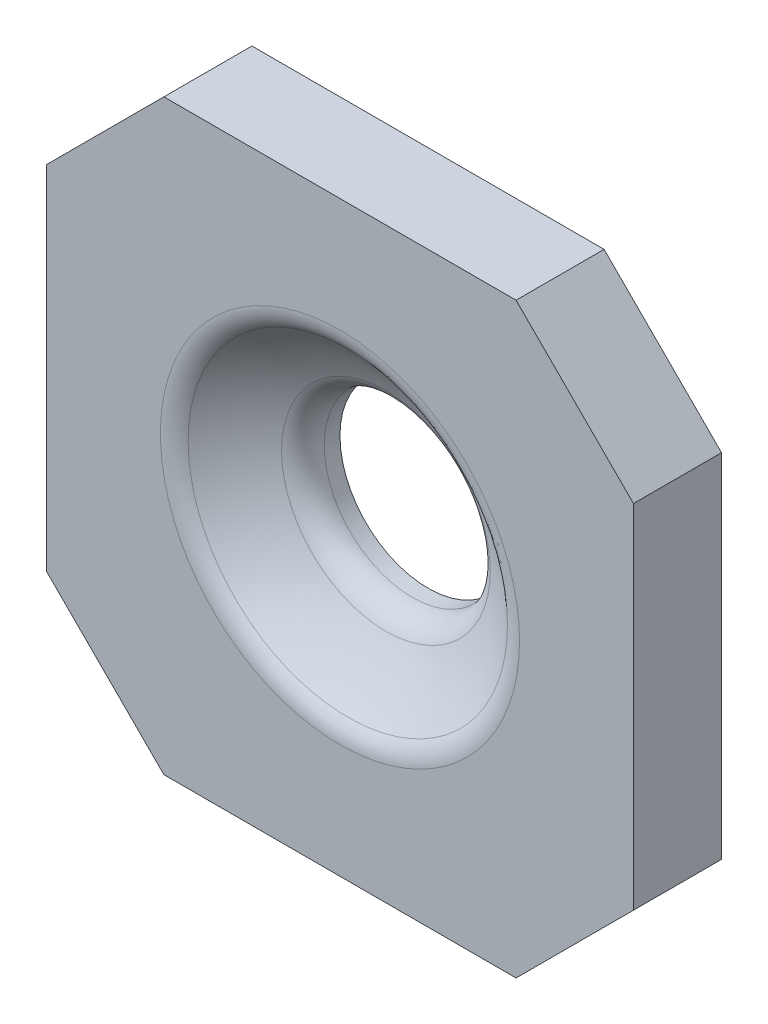
ISO-10303-21;
HEADER;
FILE_DESCRIPTION(('STEP AP214'),'2;1');
FILE_NAME('part.step','',(''),(''),'','','');
FILE_SCHEMA(('AUTOMOTIVE_DESIGN { 1 0 10303 214 1 1 1 1 }'));
ENDSEC;
DATA;
#1=APPLICATION_CONTEXT('core data for automotive mechanical design processes');
#2=APPLICATION_PROTOCOL_DEFINITION('international standard','automotive_design',2000,#1);
#3=PRODUCT_CONTEXT('',#1,'mechanical');
#4=PRODUCT('Part','Part','',(#3));
#5=PRODUCT_RELATED_PRODUCT_CATEGORY('part','',(#4));
#6=PRODUCT_DEFINITION_FORMATION('','',#4);
#7=PRODUCT_DEFINITION_CONTEXT('part definition',#1,'design');
#8=PRODUCT_DEFINITION('design','',#6,#7);
#9=PRODUCT_DEFINITION_SHAPE('','',#8);
#10=(LENGTH_UNIT() NAMED_UNIT(*) SI_UNIT(.MILLI.,.METRE.));
#11=(NAMED_UNIT(*) PLANE_ANGLE_UNIT() SI_UNIT($,.RADIAN.));
#12=(NAMED_UNIT(*) SI_UNIT($,.STERADIAN.) SOLID_ANGLE_UNIT());
#13=UNCERTAINTY_MEASURE_WITH_UNIT(LENGTH_MEASURE(1.E-05),#10,'distance_accuracy_value','');
#14=(GEOMETRIC_REPRESENTATION_CONTEXT(3) GLOBAL_UNCERTAINTY_ASSIGNED_CONTEXT((#13)) GLOBAL_UNIT_ASSIGNED_CONTEXT((#10,
#11,#12)) REPRESENTATION_CONTEXT('',''));
#15=CARTESIAN_POINT('',(0.,0.,0.));
#16=DIRECTION('',(0.,0.,1.));
#17=DIRECTION('',(1.,0.,0.));
#18=AXIS2_PLACEMENT_3D('',#15,#16,#17);
#19=CARTESIAN_POINT('',(50.,50.,15.));
#20=DIRECTION('',(-1.,0.,0.));
#21=DIRECTION('',(0.,-1.,0.));
#22=AXIS2_PLACEMENT_3D('',#19,#20,#21);
#23=PLANE('',#22);
#24=DIRECTION('',(0.,1.,0.));
#25=VECTOR('',#24,1.);
#26=CARTESIAN_POINT('',(50.,50.,0.));
#27=LINE('',#26,#25);
#28=CARTESIAN_POINT('',(50.,-30.,0.));
#29=VERTEX_POINT('',#28);
#30=CARTESIAN_POINT('',(50.,29.9999999999999,0.));
#31=VERTEX_POINT('',#30);
#32=EDGE_CURVE('E150',#29,#31,#27,.T.);
#33=ORIENTED_EDGE('',*,*,#32,.T.);
#34=DIRECTION('',(0.,0.,1.));
#35=VECTOR('',#34,1.);
#36=CARTESIAN_POINT('',(50.,29.9999999999999,15.));
#37=LINE('',#36,#35);
#38=CARTESIAN_POINT('',(50.,29.9999999999999,15.));
#39=VERTEX_POINT('',#38);
#40=EDGE_CURVE('E184',#31,#39,#37,.T.);
#41=ORIENTED_EDGE('',*,*,#40,.T.);
#42=DIRECTION('',(0.,1.,0.));
#43=VECTOR('',#42,1.);
#44=CARTESIAN_POINT('',(50.,50.,15.));
#45=LINE('',#44,#43);
#46=CARTESIAN_POINT('',(50.,-30.,15.));
#47=VERTEX_POINT('',#46);
#48=EDGE_CURVE('E148',#47,#39,#45,.T.);
#49=ORIENTED_EDGE('',*,*,#48,.F.);
#50=DIRECTION('',(0.,0.,-1.));
#51=VECTOR('',#50,1.);
#52=CARTESIAN_POINT('',(50.,-30.,15.));
#53=LINE('',#52,#51);
#54=EDGE_CURVE('E180',#47,#29,#53,.T.);
#55=ORIENTED_EDGE('',*,*,#54,.T.);
#56=EDGE_LOOP('',(#33,#41,#49,#55));
#57=FACE_BOUND('',#56,.T.);
#58=ADVANCED_FACE('F47',(#57),#23,.F.);
#59=CARTESIAN_POINT('',(-50.,50.,15.));
#60=DIRECTION('',(0.,-1.,0.));
#61=DIRECTION('',(0.,0.,-1.));
#62=AXIS2_PLACEMENT_3D('',#59,#60,#61);
#63=PLANE('',#62);
#64=DIRECTION('',(-1.,0.,0.));
#65=VECTOR('',#64,1.);
#66=CARTESIAN_POINT('',(-50.,50.,0.));
#67=LINE('',#66,#65);
#68=CARTESIAN_POINT('',(30.,50.,0.));
#69=VERTEX_POINT('',#68);
#70=CARTESIAN_POINT('',(-30.,50.,0.));
#71=VERTEX_POINT('',#70);
#72=EDGE_CURVE('E144',#69,#71,#67,.T.);
#73=ORIENTED_EDGE('',*,*,#72,.T.);
#74=DIRECTION('',(0.,0.,1.));
#75=VECTOR('',#74,1.);
#76=CARTESIAN_POINT('',(-30.,50.,15.));
#77=LINE('',#76,#75);
#78=CARTESIAN_POINT('',(-30.,50.,15.));
#79=VERTEX_POINT('',#78);
#80=EDGE_CURVE('E120',#71,#79,#77,.T.);
#81=ORIENTED_EDGE('',*,*,#80,.T.);
#82=DIRECTION('',(-1.,0.,0.));
#83=VECTOR('',#82,1.);
#84=CARTESIAN_POINT('',(-50.,50.,15.));
#85=LINE('',#84,#83);
#86=CARTESIAN_POINT('',(30.,50.,15.));
#87=VERTEX_POINT('',#86);
#88=EDGE_CURVE('E267',#87,#79,#85,.T.);
#89=ORIENTED_EDGE('',*,*,#88,.F.);
#90=DIRECTION('',(0.,0.,-1.));
#91=VECTOR('',#90,1.);
#92=CARTESIAN_POINT('',(30.,50.,15.));
#93=LINE('',#92,#91);
#94=EDGE_CURVE('E126',#87,#69,#93,.T.);
#95=ORIENTED_EDGE('',*,*,#94,.T.);
#96=EDGE_LOOP('',(#73,#81,#89,#95));
#97=FACE_BOUND('',#96,.T.);
#98=ADVANCED_FACE('F218',(#97),#63,.F.);
#99=CARTESIAN_POINT('',(-50.,50.,15.));
#100=DIRECTION('',(1.,0.,0.));
#101=DIRECTION('',(0.,1.,0.));
#102=AXIS2_PLACEMENT_3D('',#99,#100,#101);
#103=PLANE('',#102);
#104=DIRECTION('',(0.,-1.,0.));
#105=VECTOR('',#104,1.);
#106=CARTESIAN_POINT('',(-50.,50.,15.));
#107=LINE('',#106,#105);
#108=CARTESIAN_POINT('',(-50.,30.,15.));
#109=VERTEX_POINT('',#108);
#110=CARTESIAN_POINT('',(-50.,-29.9999999999999,15.));
#111=VERTEX_POINT('',#110);
#112=EDGE_CURVE('E135',#109,#111,#107,.T.);
#113=ORIENTED_EDGE('',*,*,#112,.F.);
#114=DIRECTION('',(0.,0.,-1.));
#115=VECTOR('',#114,1.);
#116=CARTESIAN_POINT('',(-50.,30.,15.));
#117=LINE('',#116,#115);
#118=CARTESIAN_POINT('',(-50.,30.,0.));
#119=VERTEX_POINT('',#118);
#120=EDGE_CURVE('E119',#109,#119,#117,.T.);
#121=ORIENTED_EDGE('',*,*,#120,.T.);
#122=DIRECTION('',(0.,-1.,0.));
#123=VECTOR('',#122,1.);
#124=CARTESIAN_POINT('',(-50.,50.,0.));
#125=LINE('',#124,#123);
#126=CARTESIAN_POINT('',(-50.,-29.9999999999999,0.));
#127=VERTEX_POINT('',#126);
#128=EDGE_CURVE('E133',#119,#127,#125,.T.);
#129=ORIENTED_EDGE('',*,*,#128,.T.);
#130=DIRECTION('',(0.,0.,1.));
#131=VECTOR('',#130,1.);
#132=CARTESIAN_POINT('',(-50.,-29.9999999999999,15.));
#133=LINE('',#132,#131);
#134=EDGE_CURVE('E138',#127,#111,#133,.T.);
#135=ORIENTED_EDGE('',*,*,#134,.T.);
#136=EDGE_LOOP('',(#113,#121,#129,#135));
#137=FACE_BOUND('',#136,.T.);
#138=ADVANCED_FACE('F132',(#137),#103,.F.);
#139=CARTESIAN_POINT('',(-50.,-50.,15.));
#140=DIRECTION('',(0.,1.,0.));
#141=DIRECTION('',(0.,0.,1.));
#142=AXIS2_PLACEMENT_3D('',#139,#140,#141);
#143=PLANE('',#142);
#144=DIRECTION('',(1.,0.,0.));
#145=VECTOR('',#144,1.);
#146=CARTESIAN_POINT('',(-50.,-50.,0.));
#147=LINE('',#146,#145);
#148=CARTESIAN_POINT('',(-30.,-50.,0.));
#149=VERTEX_POINT('',#148);
#150=CARTESIAN_POINT('',(30.,-50.,0.));
#151=VERTEX_POINT('',#150);
#152=EDGE_CURVE('E143',#149,#151,#147,.T.);
#153=ORIENTED_EDGE('',*,*,#152,.T.);
#154=DIRECTION('',(0.,0.,1.));
#155=VECTOR('',#154,1.);
#156=CARTESIAN_POINT('',(30.,-50.,15.));
#157=LINE('',#156,#155);
#158=CARTESIAN_POINT('',(30.,-50.,15.));
#159=VERTEX_POINT('',#158);
#160=EDGE_CURVE('E63',#151,#159,#157,.T.);
#161=ORIENTED_EDGE('',*,*,#160,.T.);
#162=DIRECTION('',(1.,0.,0.));
#163=VECTOR('',#162,1.);
#164=CARTESIAN_POINT('',(-50.,-50.,15.));
#165=LINE('',#164,#163);
#166=CARTESIAN_POINT('',(-30.,-50.,15.));
#167=VERTEX_POINT('',#166);
#168=EDGE_CURVE('E155',#167,#159,#165,.T.);
#169=ORIENTED_EDGE('',*,*,#168,.F.);
#170=DIRECTION('',(0.,0.,-1.));
#171=VECTOR('',#170,1.);
#172=CARTESIAN_POINT('',(-30.,-50.,15.));
#173=LINE('',#172,#171);
#174=EDGE_CURVE('E187',#167,#149,#173,.T.);
#175=ORIENTED_EDGE('',*,*,#174,.T.);
#176=EDGE_LOOP('',(#153,#161,#169,#175));
#177=FACE_BOUND('',#176,.T.);
#178=ADVANCED_FACE('F258',(#177),#143,.F.);
#179=CARTESIAN_POINT('',(0.,0.,15.));
#180=DIRECTION('',(0.,0.,1.));
#181=DIRECTION('',(1.,0.,0.));
#182=AXIS2_PLACEMENT_3D('',#179,#180,#181);
#183=PLANE('',#182);
#184=CARTESIAN_POINT('',(0.,0.,15.));
#185=DIRECTION('',(0.,0.,1.));
#186=DIRECTION('',(1.,0.,0.));
#187=AXIS2_PLACEMENT_3D('',#184,#185,#186);
#188=CIRCLE('',#187,30.5941170815567);
#189=CARTESIAN_POINT('',(30.5941170815567,0.,15.));
#190=VERTEX_POINT('',#189);
#191=EDGE_CURVE('E11',#190,#190,#188,.F.);
#192=ORIENTED_EDGE('',*,*,#191,.T.);
#193=EDGE_LOOP('',(#192));
#194=FACE_BOUND('',#193,.T.);
#195=ORIENTED_EDGE('',*,*,#88,.T.);
#196=DIRECTION('',(0.707106781186549,0.707106781186546,0.));
#197=VECTOR('',#196,1.);
#198=CARTESIAN_POINT('',(-39.9999999999999,40.0000000000001,15.));
#199=LINE('',#198,#197);
#200=EDGE_CURVE('E177',#79,#109,#199,.F.);
#201=ORIENTED_EDGE('',*,*,#200,.T.);
#202=ORIENTED_EDGE('',*,*,#112,.T.);
#203=DIRECTION('',(-0.707106781186546,0.707106781186549,0.));
#204=VECTOR('',#203,1.);
#205=CARTESIAN_POINT('',(-40.0000000000001,-39.9999999999999,15.));
#206=LINE('',#205,#204);
#207=EDGE_CURVE('E70',#111,#167,#206,.F.);
#208=ORIENTED_EDGE('',*,*,#207,.T.);
#209=ORIENTED_EDGE('',*,*,#168,.T.);
#210=DIRECTION('',(-0.707106781186549,-0.707106781186546,0.));
#211=VECTOR('',#210,1.);
#212=CARTESIAN_POINT('',(39.9999999999999,-40.0000000000001,15.));
#213=LINE('',#212,#211);
#214=EDGE_CURVE('E171',#159,#47,#213,.F.);
#215=ORIENTED_EDGE('',*,*,#214,.T.);
#216=ORIENTED_EDGE('',*,*,#48,.T.);
#217=DIRECTION('',(0.707106781186546,-0.707106781186549,0.));
#218=VECTOR('',#217,1.);
#219=CARTESIAN_POINT('',(40.0000000000001,39.9999999999999,15.));
#220=LINE('',#219,#218);
#221=EDGE_CURVE('E174',#39,#87,#220,.F.);
#222=ORIENTED_EDGE('',*,*,#221,.T.);
#223=EDGE_LOOP('',(#195,#201,#202,#208,#209,#215,#216,#222));
#224=FACE_BOUND('',#223,.T.);
#225=ADVANCED_FACE('F285',(#194,#224),#183,.T.);
#226=CARTESIAN_POINT('',(0.,0.,0.));
#227=DIRECTION('',(0.,0.,1.));
#228=DIRECTION('',(1.,0.,0.));
#229=AXIS2_PLACEMENT_3D('',#226,#227,#228);
#230=PLANE('',#229);
#231=CARTESIAN_POINT('',(0.,0.,0.));
#232=DIRECTION('',(0.,0.,-1.));
#233=DIRECTION('',(-1.,0.,0.));
#234=AXIS2_PLACEMENT_3D('',#231,#232,#233);
#235=CIRCLE('',#234,15.);
#236=CARTESIAN_POINT('',(-15.,0.,0.));
#237=VERTEX_POINT('',#236);
#238=EDGE_CURVE('E273',#237,#237,#235,.T.);
#239=ORIENTED_EDGE('',*,*,#238,.F.);
#240=EDGE_LOOP('',(#239));
#241=FACE_BOUND('',#240,.T.);
#242=ORIENTED_EDGE('',*,*,#128,.F.);
#243=DIRECTION('',(-0.707106781186549,-0.707106781186546,0.));
#244=VECTOR('',#243,1.);
#245=CARTESIAN_POINT('',(-50.,30.,0.));
#246=LINE('',#245,#244);
#247=EDGE_CURVE('E115',#119,#71,#246,.F.);
#248=ORIENTED_EDGE('',*,*,#247,.T.);
#249=ORIENTED_EDGE('',*,*,#72,.F.);
#250=DIRECTION('',(-0.707106781186546,0.707106781186549,0.));
#251=VECTOR('',#250,1.);
#252=CARTESIAN_POINT('',(30.,50.,0.));
#253=LINE('',#252,#251);
#254=EDGE_CURVE('E127',#69,#31,#253,.F.);
#255=ORIENTED_EDGE('',*,*,#254,.T.);
#256=ORIENTED_EDGE('',*,*,#32,.F.);
#257=DIRECTION('',(0.707106781186549,0.707106781186546,0.));
#258=VECTOR('',#257,1.);
#259=CARTESIAN_POINT('',(50.,-30.,0.));
#260=LINE('',#259,#258);
#261=EDGE_CURVE('E159',#29,#151,#260,.F.);
#262=ORIENTED_EDGE('',*,*,#261,.T.);
#263=ORIENTED_EDGE('',*,*,#152,.F.);
#264=DIRECTION('',(0.707106781186546,-0.707106781186549,0.));
#265=VECTOR('',#264,1.);
#266=CARTESIAN_POINT('',(-30.,-50.,0.));
#267=LINE('',#266,#265);
#268=EDGE_CURVE('E137',#149,#127,#267,.F.);
#269=ORIENTED_EDGE('',*,*,#268,.T.);
#270=EDGE_LOOP('',(#242,#248,#249,#255,#256,#262,#263,#269));
#271=FACE_BOUND('',#270,.T.);
#272=ADVANCED_FACE('F140',(#241,#271),#230,.F.);
#273=CARTESIAN_POINT('',(0.,0.,43.));
#274=DIRECTION('',(0.,0.,1.));
#275=DIRECTION('',(-1.,0.,0.));
#276=AXIS2_PLACEMENT_3D('',#273,#274,#275);
#277=SPHERICAL_SURFACE('',#276,40.);
#278=CARTESIAN_POINT('',(0.,0.,13.6666666666667));
#279=DIRECTION('',(0.,0.,1.));
#280=DIRECTION('',(1.,0.,0.));
#281=AXIS2_PLACEMENT_3D('',#278,#279,#280);
#282=CIRCLE('',#281,27.1947707391615);
#283=CARTESIAN_POINT('',(-27.1947707391615,0.,13.6666666666667));
#284=VERTEX_POINT('',#283);
#285=EDGE_CURVE('E56',#284,#284,#282,.T.);
#286=CARTESIAN_POINT('',(0.,0.,7.16774334089534));
#287=DIRECTION('',(0.,0.,1.));
#288=DIRECTION('',(1.,0.,0.));
#289=AXIS2_PLACEMENT_3D('',#286,#287,#288);
#290=CIRCLE('',#289,17.7777777777778);
#291=CARTESIAN_POINT('',(-17.7777777777778,0.,7.16774334089533));
#292=VERTEX_POINT('',#291);
#293=EDGE_CURVE('E193',#292,#292,#290,.F.);
#294=CARTESIAN_POINT('',(-27.1947707391615,0.,13.6666666666667));
#295=CARTESIAN_POINT('',(-27.1070670291022,0.,13.585357022079));
#296=CARTESIAN_POINT('',(-27.0189986370714,0.,13.504440737949));
#297=CARTESIAN_POINT('',(-26.8421396204328,0.,13.3434013503905));
#298=CARTESIAN_POINT('',(-26.7533489958252,0.,13.2632782469621));
#299=CARTESIAN_POINT('',(-26.5750526453992,0.,13.1038316805934));
#300=CARTESIAN_POINT('',(-26.485546919581,0.,13.024508217653));
#301=CARTESIAN_POINT('',(-26.3058275712033,0.,12.8666673106126));
#302=CARTESIAN_POINT('',(-26.2156139486438,0.,12.7881498665125));
#303=CARTESIAN_POINT('',(-26.0344860640351,0.,12.6319273152382));
#304=CARTESIAN_POINT('',(-25.9435718019858,0.,12.554222208064));
#305=CARTESIAN_POINT('',(-25.7610499531365,0.,12.3996305821429));
#306=CARTESIAN_POINT('',(-25.6694423663365,0.,12.3227440633961));
#307=CARTESIAN_POINT('',(-25.4855412382067,0.,12.1697958003008));
#308=CARTESIAN_POINT('',(-25.3932476968769,0.,12.0937340559522));
#309=CARTESIAN_POINT('',(-25.2079820851773,0.,11.9424414611791));
#310=CARTESIAN_POINT('',(-25.1150100148074,0.,11.8672106107545));
#311=CARTESIAN_POINT('',(-24.9283948250869,0.,11.7175858565289));
#312=CARTESIAN_POINT('',(-24.8347517057362,0.,11.6431919527279));
#313=CARTESIAN_POINT('',(-24.6468019521081,0.,11.4952470771063));
#314=CARTESIAN_POINT('',(-24.5524953178307,0.,11.4216961052857));
#315=CARTESIAN_POINT('',(-24.3632261217849,0.,11.2754430111655));
#316=CARTESIAN_POINT('',(-24.2682635600166,0.,11.2027408888659));
#317=CARTESIAN_POINT('',(-24.0776901491976,0.,11.0581913430335));
#318=CARTESIAN_POINT('',(-23.9820793001469,0.,10.9863439195007));
#319=CARTESIAN_POINT('',(-23.79021700713,0.,10.8435095516832));
#320=CARTESIAN_POINT('',(-23.6939655631637,0.,10.7725226073985));
#321=CARTESIAN_POINT('',(-23.5008298242209,0.,10.6314149093286));
#322=CARTESIAN_POINT('',(-23.4039455292445,0.,10.5612941555434));
#323=CARTESIAN_POINT('',(-23.2095518831032,0.,10.4219244800346));
#324=CARTESIAN_POINT('',(-23.1120425319383,0.,10.352675558311));
#325=CARTESIAN_POINT('',(-22.9164066185305,0.,10.2150551183443));
#326=CARTESIAN_POINT('',(-22.8182800562875,0.,10.1466836001012));
#327=CARTESIAN_POINT('',(-22.6214176154918,0.,10.0108234679229));
#328=CARTESIAN_POINT('',(-22.522681736939,0.,9.94333485398777));
#329=CARTESIAN_POINT('',(-22.3246086073143,0.,9.80924596021874));
#330=CARTESIAN_POINT('',(-22.2252713562423,0.,9.74264568038489));
#331=CARTESIAN_POINT('',(-22.0260034737533,0.,9.61033881314105));
#332=CARTESIAN_POINT('',(-21.9260728423362,0.,9.54463222573106));
#333=CARTESIAN_POINT('',(-21.7256262390715,0.,9.41411802975546));
#334=CARTESIAN_POINT('',(-21.6251102672238,0.,9.34931042118986));
#335=CARTESIAN_POINT('',(-21.4235010701057,0.,9.22059939699629));
#336=CARTESIAN_POINT('',(-21.3224078448354,0.,9.15669598136833));
#337=CARTESIAN_POINT('',(-21.119652274323,0.,9.02979848439645));
#338=CARTESIAN_POINT('',(-21.0179899290809,0.,8.96680440305253));
#339=CARTESIAN_POINT('',(-20.8141042978644,0.,8.84173064283484));
#340=CARTESIAN_POINT('',(-20.71188101189,0.,8.77965096396107));
#341=CARTESIAN_POINT('',(-20.5068817235789,0.,8.65641100330101));
#342=CARTESIAN_POINT('',(-20.4041057212422,0.,8.59525072151473));
#343=CARTESIAN_POINT('',(-20.1980092690444,0.,8.473854475679));
#344=CARTESIAN_POINT('',(-20.0946888191833,0.,8.41361851162955));
#345=CARTESIAN_POINT('',(-19.8875117845819,0.,8.29407574754325));
#346=CARTESIAN_POINT('',(-19.7836551998416,0.,8.23476894750639));
#347=CARTESIAN_POINT('',(-19.5754142512473,0.,8.11708928299368));
#348=CARTESIAN_POINT('',(-19.4710298873932,0.,8.05871641851783));
#349=CARTESIAN_POINT('',(-19.2617417788533,0.,7.94290932142946));
#350=CARTESIAN_POINT('',(-19.1568380341673,0.,7.88547508881694));
#351=CARTESIAN_POINT('',(-18.9465196038309,0.,7.77154987663677));
#352=CARTESIAN_POINT('',(-18.8411049181804,0.,7.71505889706911));
#353=CARTESIAN_POINT('',(-18.629773087641,0.,7.6030247347901));
#354=CARTESIAN_POINT('',(-18.5238559427522,0.,7.54748155207875));
#355=CARTESIAN_POINT('',(-18.3115277130843,0.,7.43734745659482));
#356=CARTESIAN_POINT('',(-18.2051166283051,0.,7.38275654382224));
#357=CARTESIAN_POINT('',(-17.9918090884078,0.,7.27453136406028));
#358=CARTESIAN_POINT('',(-17.8849126332897,0.,7.2208970970709));
#359=CARTESIAN_POINT('',(-17.7777777777778,0.,7.16774334089533));
#360=B_SPLINE_CURVE_WITH_KNOTS('',3,(#294,#295,#296,#297,#298,#299,#300,#301,#302,#303,#304,
#305,#306,#307,#308,#309,#310,#311,#312,#313,#314,#315,#316,#317,#318,#319,#320,#321,#322,#323,
#324,#325,#326,#327,#328,#329,#330,#331,#332,#333,#334,#335,#336,#337,#338,#339,#340,#341,#342,
#343,#344,#345,#346,#347,#348,#349,#350,#351,#352,#353,#354,#355,#356,#357,#358,#359),
.UNSPECIFIED.,.F.,.F.,(4,2,2,2,2,2,2,2,2,2,2,2,2,2,2,2,2,2,2,2,2,2,2,2,2,2,2,2,2,2,2,2,4),(0.,
0.358786744716595,0.717573489433186,1.07636023414978,1.43514697886638,1.79393372358297,
2.15272046829956,2.51150721301615,2.87029395773275,3.22908070244934,3.58786744716593,
3.94665419188253,4.30544093659912,4.66422768131572,5.02301442603231,5.3818011707489,
5.7405879154655,6.09937466018209,6.45816140489868,6.81694814961527,7.17573489433187,
7.53452163904846,7.89330838376505,8.25209512848165,8.61088187319824,8.96966861791484,
9.32845536263143,9.68724210734802,10.0460288520646,10.4048155967812,10.7636023414978,
11.1223890862144,11.481175830931),.UNSPECIFIED.);
#361=EDGE_CURVE('BSEAM204',#284,#292,#360,.T.);
#362=ORIENTED_EDGE('',*,*,#285,.T.);
#363=ORIENTED_EDGE('',*,*,#293,.T.);
#364=ORIENTED_EDGE('',*,*,#361,.T.);
#365=ORIENTED_EDGE('',*,*,#361,.F.);
#366=EDGE_LOOP('',(#362,#364,#363,#365));
#367=FACE_BOUND('',#366,.T.);
#368=ADVANCED_FACE('F204',(#367),#277,.F.);
#369=CARTESIAN_POINT('',(0.,0.,15.));
#370=DIRECTION('',(0.,0.,-1.));
#371=DIRECTION('',(-1.,0.,0.));
#372=AXIS2_PLACEMENT_3D('',#369,#370,#371);
#373=CYLINDRICAL_SURFACE('',#372,15.);
#374=CARTESIAN_POINT('',(0.,0.,2.68871125850725));
#375=DIRECTION('',(0.,0.,1.));
#376=DIRECTION('',(1.,0.,0.));
#377=AXIS2_PLACEMENT_3D('',#374,#375,#376);
#378=CIRCLE('',#377,15.);
#379=CARTESIAN_POINT('',(15.,0.,2.68871125850725));
#380=VERTEX_POINT('',#379);
#381=EDGE_CURVE('E197',#380,#380,#378,.T.);
#382=ORIENTED_EDGE('',*,*,#381,.T.);
#383=EDGE_LOOP('',(#382));
#384=FACE_BOUND('',#383,.T.);
#385=ORIENTED_EDGE('',*,*,#238,.T.);
#386=EDGE_LOOP('',(#385));
#387=FACE_BOUND('',#386,.T.);
#388=ADVANCED_FACE('F236',(#384,#387),#373,.F.);
#389=CARTESIAN_POINT('',(-50.,30.,15.));
#390=DIRECTION('',(0.707106781186546,-0.707106781186549,0.));
#391=DIRECTION('',(0.,0.,-1.));
#392=AXIS2_PLACEMENT_3D('',#389,#390,#391);
#393=PLANE('',#392);
#394=ORIENTED_EDGE('',*,*,#200,.F.);
#395=ORIENTED_EDGE('',*,*,#80,.F.);
#396=ORIENTED_EDGE('',*,*,#247,.F.);
#397=ORIENTED_EDGE('',*,*,#120,.F.);
#398=EDGE_LOOP('',(#394,#395,#396,#397));
#399=FACE_BOUND('',#398,.T.);
#400=ADVANCED_FACE('F118',(#399),#393,.F.);
#401=CARTESIAN_POINT('',(30.,50.,15.));
#402=DIRECTION('',(-0.707106781186549,-0.707106781186546,0.));
#403=DIRECTION('',(0.,0.,-1.));
#404=AXIS2_PLACEMENT_3D('',#401,#402,#403);
#405=PLANE('',#404);
#406=ORIENTED_EDGE('',*,*,#221,.F.);
#407=ORIENTED_EDGE('',*,*,#40,.F.);
#408=ORIENTED_EDGE('',*,*,#254,.F.);
#409=ORIENTED_EDGE('',*,*,#94,.F.);
#410=EDGE_LOOP('',(#406,#407,#408,#409));
#411=FACE_BOUND('',#410,.T.);
#412=ADVANCED_FACE('F235',(#411),#405,.F.);
#413=CARTESIAN_POINT('',(50.,-30.,15.));
#414=DIRECTION('',(-0.707106781186546,0.707106781186549,0.));
#415=DIRECTION('',(0.,0.,-1.));
#416=AXIS2_PLACEMENT_3D('',#413,#414,#415);
#417=PLANE('',#416);
#418=ORIENTED_EDGE('',*,*,#214,.F.);
#419=ORIENTED_EDGE('',*,*,#160,.F.);
#420=ORIENTED_EDGE('',*,*,#261,.F.);
#421=ORIENTED_EDGE('',*,*,#54,.F.);
#422=EDGE_LOOP('',(#418,#419,#420,#421));
#423=FACE_BOUND('',#422,.T.);
#424=ADVANCED_FACE('F242',(#423),#417,.F.);
#425=CARTESIAN_POINT('',(-30.,-50.,15.));
#426=DIRECTION('',(0.707106781186549,0.707106781186546,0.));
#427=DIRECTION('',(0.,0.,-1.));
#428=AXIS2_PLACEMENT_3D('',#425,#426,#427);
#429=PLANE('',#428);
#430=ORIENTED_EDGE('',*,*,#207,.F.);
#431=ORIENTED_EDGE('',*,*,#134,.F.);
#432=ORIENTED_EDGE('',*,*,#268,.F.);
#433=ORIENTED_EDGE('',*,*,#174,.F.);
#434=EDGE_LOOP('',(#430,#431,#432,#433));
#435=FACE_BOUND('',#434,.T.);
#436=ADVANCED_FACE('F214',(#435),#429,.F.);
#437=CARTESIAN_POINT('',(0.,0.,2.68871125850725));
#438=DIRECTION('',(0.,0.,1.));
#439=DIRECTION('',(1.,0.,0.));
#440=AXIS2_PLACEMENT_3D('',#437,#438,#439);
#441=TOROIDAL_SURFACE('',#440,20.,5.);
#442=ORIENTED_EDGE('',*,*,#381,.F.);
#443=EDGE_LOOP('',(#442));
#444=FACE_BOUND('',#443,.T.);
#445=ORIENTED_EDGE('',*,*,#293,.F.);
#446=EDGE_LOOP('',(#445));
#447=FACE_BOUND('',#446,.T.);
#448=ADVANCED_FACE('F208',(#444,#447),#441,.T.);
#449=CARTESIAN_POINT('',(0.,0.,10.));
#450=DIRECTION('',(0.,0.,1.));
#451=DIRECTION('',(1.,0.,0.));
#452=AXIS2_PLACEMENT_3D('',#449,#450,#451);
#453=TOROIDAL_SURFACE('',#452,30.5941170815567,5.);
#454=ORIENTED_EDGE('',*,*,#191,.F.);
#455=EDGE_LOOP('',(#454));
#456=FACE_BOUND('',#455,.T.);
#457=ORIENTED_EDGE('',*,*,#285,.F.);
#458=EDGE_LOOP('',(#457));
#459=FACE_BOUND('',#458,.T.);
#460=ADVANCED_FACE('F49',(#456,#459),#453,.T.);
#461=CLOSED_SHELL('',(#58,#98,#138,#178,#225,#272,#368,#388,#400,#412,#424,#436,#448,#460));
#462=MANIFOLD_SOLID_BREP('B2',#461);
#463=ADVANCED_BREP_SHAPE_REPRESENTATION('',(#18,#462),#14);
#464=SHAPE_DEFINITION_REPRESENTATION(#9,#463);
ENDSEC;
END-ISO-10303-21;
